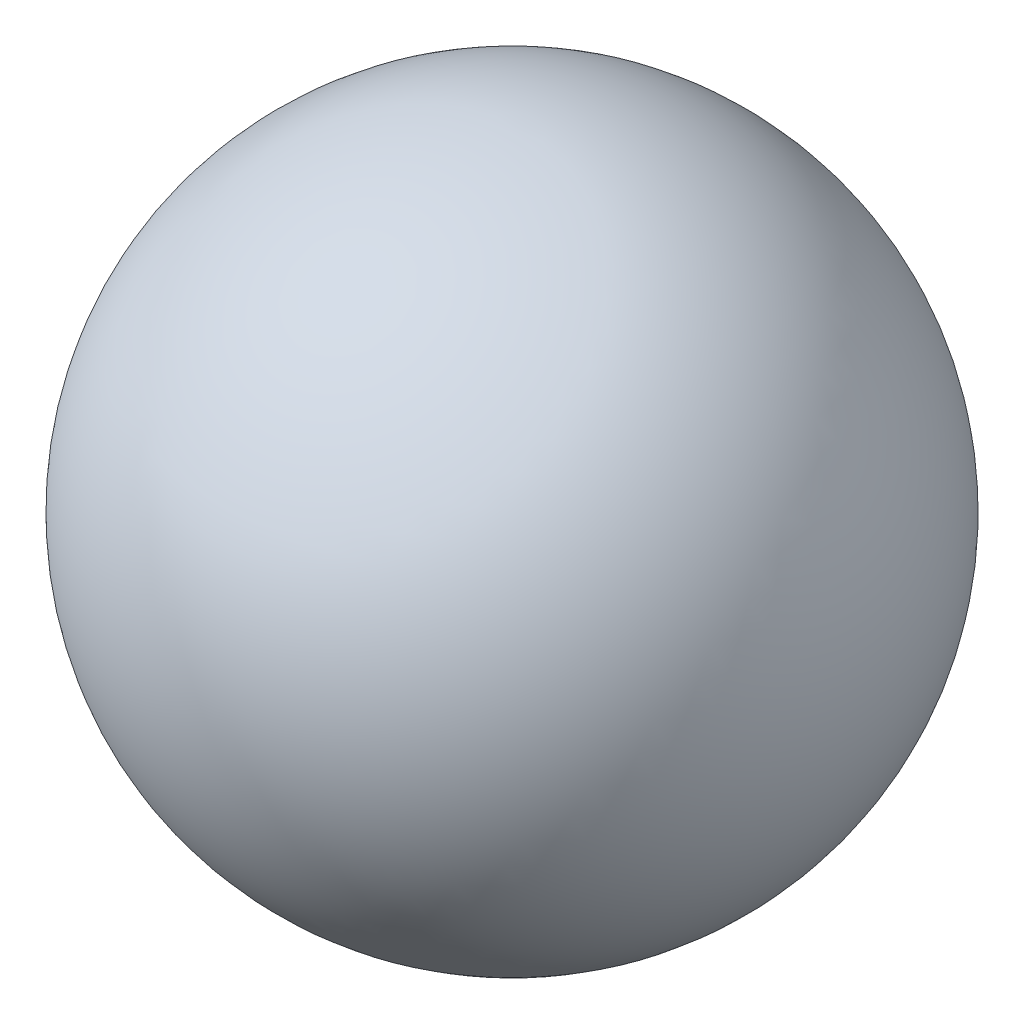
ISO-10303-21;
HEADER;
FILE_DESCRIPTION(('STEP AP214'),'2;1');
FILE_NAME('part.step','',(''),(''),'','','');
FILE_SCHEMA(('AUTOMOTIVE_DESIGN { 1 0 10303 214 1 1 1 1 }'));
ENDSEC;
DATA;
#1=APPLICATION_CONTEXT('core data for automotive mechanical design processes');
#2=APPLICATION_PROTOCOL_DEFINITION('international standard','automotive_design',2000,#1);
#3=PRODUCT_CONTEXT('',#1,'mechanical');
#4=PRODUCT('Part','Part','',(#3));
#5=PRODUCT_RELATED_PRODUCT_CATEGORY('part','',(#4));
#6=PRODUCT_DEFINITION_FORMATION('','',#4);
#7=PRODUCT_DEFINITION_CONTEXT('part definition',#1,'design');
#8=PRODUCT_DEFINITION('design','',#6,#7);
#9=PRODUCT_DEFINITION_SHAPE('','',#8);
#10=(LENGTH_UNIT() NAMED_UNIT(*) SI_UNIT(.MILLI.,.METRE.));
#11=(NAMED_UNIT(*) PLANE_ANGLE_UNIT() SI_UNIT($,.RADIAN.));
#12=(NAMED_UNIT(*) SI_UNIT($,.STERADIAN.) SOLID_ANGLE_UNIT());
#13=UNCERTAINTY_MEASURE_WITH_UNIT(LENGTH_MEASURE(1.E-05),#10,'distance_accuracy_value','');
#14=(GEOMETRIC_REPRESENTATION_CONTEXT(3) GLOBAL_UNCERTAINTY_ASSIGNED_CONTEXT((#13)) GLOBAL_UNIT_ASSIGNED_CONTEXT((#10,
#11,#12)) REPRESENTATION_CONTEXT('',''));
#15=CARTESIAN_POINT('',(0.,0.,0.));
#16=DIRECTION('',(0.,0.,1.));
#17=DIRECTION('',(1.,0.,0.));
#18=AXIS2_PLACEMENT_3D('',#15,#16,#17);
#19=CARTESIAN_POINT('',(0.,0.,0.));
#20=DIRECTION('',(0.,1.,0.));
#21=DIRECTION('',(1.,0.,0.));
#22=AXIS2_PLACEMENT_3D('',#19,#20,#21);
#23=SPHERICAL_SURFACE('',#22,20.);
#24=CARTESIAN_POINT('',(0.,-18.,0.));
#25=DIRECTION('',(0.,1.,0.));
#26=DIRECTION('',(0.,0.,1.));
#27=AXIS2_PLACEMENT_3D('',#24,#25,#26);
#28=CIRCLE('',#27,8.71779788708134);
#29=CARTESIAN_POINT('',(0.,-18.,8.71779788708134));
#30=VERTEX_POINT('',#29);
#31=EDGE_CURVE('E11',#30,#30,#28,.T.);
#32=ORIENTED_EDGE('',*,*,#31,.T.);
#33=EDGE_LOOP('',(#32));
#34=FACE_BOUND('',#33,.T.);
#35=ADVANCED_FACE('F52',(#34),#23,.T.);
#36=CARTESIAN_POINT('',(-8.71779788708134,-18.,86.6025403784439));
#37=DIRECTION('',(0.,1.,0.));
#38=DIRECTION('',(0.,0.,1.));
#39=AXIS2_PLACEMENT_3D('',#36,#37,#38);
#40=PLANE('',#39);
#41=CARTESIAN_POINT('',(0.,-18.,0.));
#42=DIRECTION('',(0.,-1.,0.));
#43=DIRECTION('',(0.,0.,-1.));
#44=AXIS2_PLACEMENT_3D('',#41,#42,#43);
#45=CIRCLE('',#44,4.25);
#46=CARTESIAN_POINT('',(0.,-18.,-4.25));
#47=VERTEX_POINT('',#46);
#48=EDGE_CURVE('E71',#47,#47,#45,.T.);
#49=ORIENTED_EDGE('',*,*,#48,.F.);
#50=EDGE_LOOP('',(#49));
#51=FACE_BOUND('',#50,.T.);
#52=ORIENTED_EDGE('',*,*,#31,.F.);
#53=EDGE_LOOP('',(#52));
#54=FACE_BOUND('',#53,.T.);
#55=ADVANCED_FACE('F70',(#51,#54),#40,.F.);
#56=CARTESIAN_POINT('',(0.,-8.,0.));
#57=DIRECTION('',(0.,-1.,0.));
#58=DIRECTION('',(0.,0.,-1.));
#59=AXIS2_PLACEMENT_3D('',#56,#57,#58);
#60=CONICAL_SURFACE('',#59,4.25,1.02974425867665);
#61=CARTESIAN_POINT('',(0.,-5.44634236913287,0.));
#62=VERTEX_POINT('',#61);
#63=VERTEX_LOOP('',#62);
#64=FACE_BOUND('',#63,.T.);
#65=CARTESIAN_POINT('',(0.,-8.,0.));
#66=DIRECTION('',(0.,-1.,0.));
#67=DIRECTION('',(0.,0.,-1.));
#68=AXIS2_PLACEMENT_3D('',#65,#66,#67);
#69=CIRCLE('',#68,4.25);
#70=CARTESIAN_POINT('',(0.,-8.,-4.25));
#71=VERTEX_POINT('',#70);
#72=EDGE_CURVE('E58',#71,#71,#69,.T.);
#73=ORIENTED_EDGE('',*,*,#72,.T.);
#74=EDGE_LOOP('',(#73));
#75=FACE_BOUND('',#74,.T.);
#76=ADVANCED_FACE('F64',(#64,#75),#60,.F.);
#77=CARTESIAN_POINT('',(0.,-18.,0.));
#78=DIRECTION('',(0.,-1.,0.));
#79=DIRECTION('',(0.,0.,-1.));
#80=AXIS2_PLACEMENT_3D('',#77,#78,#79);
#81=CYLINDRICAL_SURFACE('',#80,4.25);
#82=ORIENTED_EDGE('',*,*,#72,.F.);
#83=EDGE_LOOP('',(#82));
#84=FACE_BOUND('',#83,.T.);
#85=ORIENTED_EDGE('',*,*,#48,.T.);
#86=EDGE_LOOP('',(#85));
#87=FACE_BOUND('',#86,.T.);
#88=ADVANCED_FACE('F67',(#84,#87),#81,.F.);
#89=CLOSED_SHELL('',(#35,#55,#76,#88));
#90=MANIFOLD_SOLID_BREP('B2',#89);
#91=ADVANCED_BREP_SHAPE_REPRESENTATION('',(#18,#90),#14);
#92=SHAPE_DEFINITION_REPRESENTATION(#9,#91);
ENDSEC;
END-ISO-10303-21;
